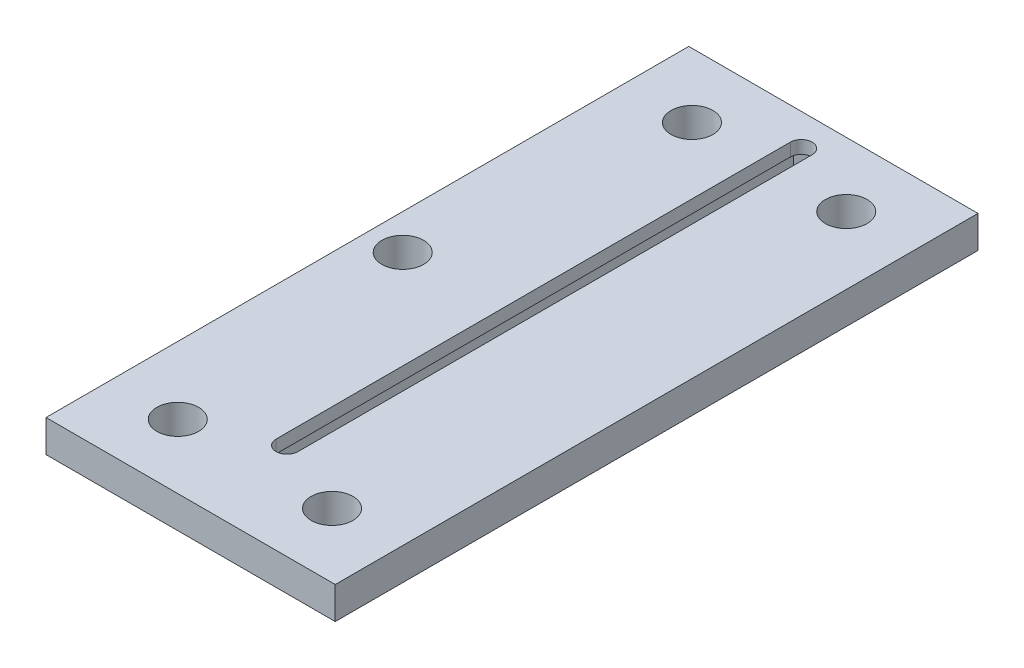
ISO-10303-21;
HEADER;
FILE_DESCRIPTION(('STEP AP214'),'2;1');
FILE_NAME('part.step','',(''),(''),'','','');
FILE_SCHEMA(('AUTOMOTIVE_DESIGN { 1 0 10303 214 1 1 1 1 }'));
ENDSEC;
DATA;
#1=APPLICATION_CONTEXT('core data for automotive mechanical design processes');
#2=APPLICATION_PROTOCOL_DEFINITION('international standard','automotive_design',2000,#1);
#3=PRODUCT_CONTEXT('',#1,'mechanical');
#4=PRODUCT('Part','Part','',(#3));
#5=PRODUCT_RELATED_PRODUCT_CATEGORY('part','',(#4));
#6=PRODUCT_DEFINITION_FORMATION('','',#4);
#7=PRODUCT_DEFINITION_CONTEXT('part definition',#1,'design');
#8=PRODUCT_DEFINITION('design','',#6,#7);
#9=PRODUCT_DEFINITION_SHAPE('','',#8);
#10=(LENGTH_UNIT() NAMED_UNIT(*) SI_UNIT(.MILLI.,.METRE.));
#11=(NAMED_UNIT(*) PLANE_ANGLE_UNIT() SI_UNIT($,.RADIAN.));
#12=(NAMED_UNIT(*) SI_UNIT($,.STERADIAN.) SOLID_ANGLE_UNIT());
#13=UNCERTAINTY_MEASURE_WITH_UNIT(LENGTH_MEASURE(1.E-05),#10,'distance_accuracy_value','');
#14=(GEOMETRIC_REPRESENTATION_CONTEXT(3) GLOBAL_UNCERTAINTY_ASSIGNED_CONTEXT((#13)) GLOBAL_UNIT_ASSIGNED_CONTEXT((#10,
#11,#12)) REPRESENTATION_CONTEXT('',''));
#15=CARTESIAN_POINT('',(0.,0.,0.));
#16=DIRECTION('',(0.,0.,1.));
#17=DIRECTION('',(1.,0.,0.));
#18=AXIS2_PLACEMENT_3D('',#15,#16,#17);
#19=CARTESIAN_POINT('',(0.,5.,0.));
#20=DIRECTION('',(0.,-1.,0.));
#21=DIRECTION('',(0.,0.,-1.));
#22=AXIS2_PLACEMENT_3D('',#19,#20,#21);
#23=PLANE('',#22);
#24=DIRECTION('',(0.,0.,1.));
#25=VECTOR('',#24,1.);
#26=CARTESIAN_POINT('',(-1.7,5.,-45.));
#27=LINE('',#26,#25);
#28=CARTESIAN_POINT('',(-1.7,5.,-45.));
#29=VERTEX_POINT('',#28);
#30=CARTESIAN_POINT('',(-1.69999999999999,5.,35.));
#31=VERTEX_POINT('',#30);
#32=EDGE_CURVE('E201',#29,#31,#27,.T.);
#33=ORIENTED_EDGE('',*,*,#32,.F.);
#34=CARTESIAN_POINT('',(0.,5.,-45.));
#35=DIRECTION('',(0.,1.,0.));
#36=DIRECTION('',(0.,0.,1.));
#37=AXIS2_PLACEMENT_3D('',#34,#35,#36);
#38=CIRCLE('',#37,1.7);
#39=CARTESIAN_POINT('',(1.7,5.,-45.));
#40=VERTEX_POINT('',#39);
#41=EDGE_CURVE('E62',#40,#29,#38,.T.);
#42=ORIENTED_EDGE('',*,*,#41,.F.);
#43=DIRECTION('',(0.,0.,-1.));
#44=VECTOR('',#43,1.);
#45=CARTESIAN_POINT('',(1.7,5.,-45.));
#46=LINE('',#45,#44);
#47=CARTESIAN_POINT('',(1.70000000000001,5.,35.));
#48=VERTEX_POINT('',#47);
#49=EDGE_CURVE('E193',#48,#40,#46,.T.);
#50=ORIENTED_EDGE('',*,*,#49,.F.);
#51=CARTESIAN_POINT('',(0.,5.,35.));
#52=DIRECTION('',(0.,1.,0.));
#53=DIRECTION('',(0.,0.,1.));
#54=AXIS2_PLACEMENT_3D('',#51,#52,#53);
#55=CIRCLE('',#54,1.7);
#56=EDGE_CURVE('E204',#31,#48,#55,.T.);
#57=ORIENTED_EDGE('',*,*,#56,.F.);
#58=EDGE_LOOP('',(#33,#42,#50,#57));
#59=FACE_BOUND('',#58,.T.);
#60=DIRECTION('',(0.,0.,-1.));
#61=VECTOR('',#60,1.);
#62=CARTESIAN_POINT('',(22.5,5.,50.));
#63=LINE('',#62,#61);
#64=CARTESIAN_POINT('',(22.5,5.,50.));
#65=VERTEX_POINT('',#64);
#66=CARTESIAN_POINT('',(22.5,5.,-50.));
#67=VERTEX_POINT('',#66);
#68=EDGE_CURVE('E247',#65,#67,#63,.T.);
#69=ORIENTED_EDGE('',*,*,#68,.T.);
#70=DIRECTION('',(-1.,0.,0.));
#71=VECTOR('',#70,1.);
#72=CARTESIAN_POINT('',(-22.5,5.,-50.));
#73=LINE('',#72,#71);
#74=CARTESIAN_POINT('',(-22.5,5.,-50.));
#75=VERTEX_POINT('',#74);
#76=EDGE_CURVE('E250',#67,#75,#73,.T.);
#77=ORIENTED_EDGE('',*,*,#76,.T.);
#78=DIRECTION('',(0.,0.,1.));
#79=VECTOR('',#78,1.);
#80=CARTESIAN_POINT('',(-22.5,5.,50.));
#81=LINE('',#80,#79);
#82=CARTESIAN_POINT('',(-22.5,5.,50.));
#83=VERTEX_POINT('',#82);
#84=EDGE_CURVE('E253',#75,#83,#81,.T.);
#85=ORIENTED_EDGE('',*,*,#84,.T.);
#86=DIRECTION('',(1.,0.,0.));
#87=VECTOR('',#86,1.);
#88=CARTESIAN_POINT('',(-22.5,5.,50.));
#89=LINE('',#88,#87);
#90=EDGE_CURVE('E255',#83,#65,#89,.T.);
#91=ORIENTED_EDGE('',*,*,#90,.T.);
#92=EDGE_LOOP('',(#69,#77,#85,#91));
#93=FACE_BOUND('',#92,.T.);
#94=CARTESIAN_POINT('',(-12.,5.,-40.));
#95=DIRECTION('',(0.,1.,0.));
#96=DIRECTION('',(0.,0.,1.));
#97=AXIS2_PLACEMENT_3D('',#94,#95,#96);
#98=CIRCLE('',#97,3.25);
#99=CARTESIAN_POINT('',(-12.,5.,-36.75));
#100=VERTEX_POINT('',#99);
#101=EDGE_CURVE('E241',#100,#100,#98,.T.);
#102=ORIENTED_EDGE('',*,*,#101,.F.);
#103=EDGE_LOOP('',(#102));
#104=FACE_BOUND('',#103,.T.);
#105=CARTESIAN_POINT('',(12.,5.,-40.));
#106=DIRECTION('',(0.,1.,0.));
#107=DIRECTION('',(0.,0.,1.));
#108=AXIS2_PLACEMENT_3D('',#105,#106,#107);
#109=CIRCLE('',#108,3.25);
#110=CARTESIAN_POINT('',(12.,5.,-36.75));
#111=VERTEX_POINT('',#110);
#112=EDGE_CURVE('E235',#111,#111,#109,.T.);
#113=ORIENTED_EDGE('',*,*,#112,.F.);
#114=EDGE_LOOP('',(#113));
#115=FACE_BOUND('',#114,.T.);
#116=CARTESIAN_POINT('',(12.,5.,40.));
#117=DIRECTION('',(0.,1.,0.));
#118=DIRECTION('',(0.,0.,1.));
#119=AXIS2_PLACEMENT_3D('',#116,#117,#118);
#120=CIRCLE('',#119,3.25);
#121=CARTESIAN_POINT('',(12.,5.,43.25));
#122=VERTEX_POINT('',#121);
#123=EDGE_CURVE('E229',#122,#122,#120,.T.);
#124=ORIENTED_EDGE('',*,*,#123,.F.);
#125=EDGE_LOOP('',(#124));
#126=FACE_BOUND('',#125,.T.);
#127=CARTESIAN_POINT('',(-12.,5.,40.));
#128=DIRECTION('',(0.,1.,0.));
#129=DIRECTION('',(0.,0.,1.));
#130=AXIS2_PLACEMENT_3D('',#127,#128,#129);
#131=CIRCLE('',#130,3.25);
#132=CARTESIAN_POINT('',(-12.,5.,43.25));
#133=VERTEX_POINT('',#132);
#134=EDGE_CURVE('E223',#133,#133,#131,.T.);
#135=ORIENTED_EDGE('',*,*,#134,.F.);
#136=EDGE_LOOP('',(#135));
#137=FACE_BOUND('',#136,.T.);
#138=CARTESIAN_POINT('',(-17.,5.,0.));
#139=DIRECTION('',(0.,1.,0.));
#140=DIRECTION('',(0.,0.,1.));
#141=AXIS2_PLACEMENT_3D('',#138,#139,#140);
#142=CIRCLE('',#141,3.25);
#143=CARTESIAN_POINT('',(-17.,5.,3.25));
#144=VERTEX_POINT('',#143);
#145=EDGE_CURVE('E217',#144,#144,#142,.T.);
#146=ORIENTED_EDGE('',*,*,#145,.F.);
#147=EDGE_LOOP('',(#146));
#148=FACE_BOUND('',#147,.T.);
#149=ADVANCED_FACE('F39',(#59,#93,#104,#115,#126,#137,#148),#23,.F.);
#150=CARTESIAN_POINT('',(0.,0.,0.));
#151=DIRECTION('',(0.,-1.,0.));
#152=DIRECTION('',(0.,0.,-1.));
#153=AXIS2_PLACEMENT_3D('',#150,#151,#152);
#154=PLANE('',#153);
#155=DIRECTION('',(0.,0.,1.));
#156=VECTOR('',#155,1.);
#157=CARTESIAN_POINT('',(-2.9,0.,0.));
#158=LINE('',#157,#156);
#159=CARTESIAN_POINT('',(-2.9,0.,-46.6743157806499));
#160=VERTEX_POINT('',#159);
#161=CARTESIAN_POINT('',(-2.9,0.,36.6743157806499));
#162=VERTEX_POINT('',#161);
#163=EDGE_CURVE('E152',#160,#162,#158,.T.);
#164=ORIENTED_EDGE('',*,*,#163,.T.);
#165=DIRECTION('',(0.866025403784438,0.,0.500000000000001));
#166=VECTOR('',#165,1.);
#167=CARTESIAN_POINT('',(-16.6054445662277,0.,28.7614736709748));
#168=LINE('',#167,#166);
#169=CARTESIAN_POINT('',(0.,0.,38.3486315612998));
#170=VERTEX_POINT('',#169);
#171=EDGE_CURVE('E139',#162,#170,#168,.T.);
#172=ORIENTED_EDGE('',*,*,#171,.T.);
#173=DIRECTION('',(0.866025403784439,0.,-0.5));
#174=VECTOR('',#173,1.);
#175=CARTESIAN_POINT('',(16.6054445662277,0.,28.7614736709748));
#176=LINE('',#175,#174);
#177=CARTESIAN_POINT('',(2.9,0.,36.6743157806499));
#178=VERTEX_POINT('',#177);
#179=EDGE_CURVE('E507',#170,#178,#176,.T.);
#180=ORIENTED_EDGE('',*,*,#179,.T.);
#181=DIRECTION('',(0.,0.,-1.));
#182=VECTOR('',#181,1.);
#183=CARTESIAN_POINT('',(2.90000000000001,0.,0.));
#184=LINE('',#183,#182);
#185=CARTESIAN_POINT('',(2.9,0.,-46.6743157806499));
#186=VERTEX_POINT('',#185);
#187=EDGE_CURVE('E506',#178,#186,#184,.T.);
#188=ORIENTED_EDGE('',*,*,#187,.T.);
#189=DIRECTION('',(-0.866025403784437,0.,-0.500000000000002));
#190=VECTOR('',#189,1.);
#191=CARTESIAN_POINT('',(20.9355715851499,0.,-36.2614736709748));
#192=LINE('',#191,#190);
#193=CARTESIAN_POINT('',(0.,0.,-48.3486315612998));
#194=VERTEX_POINT('',#193);
#195=EDGE_CURVE('E166',#186,#194,#192,.T.);
#196=ORIENTED_EDGE('',*,*,#195,.T.);
#197=DIRECTION('',(-0.866025403784438,0.,0.500000000000001));
#198=VECTOR('',#197,1.);
#199=CARTESIAN_POINT('',(-20.9355715851499,0.,-36.2614736709748));
#200=LINE('',#199,#198);
#201=EDGE_CURVE('E162',#194,#160,#200,.T.);
#202=ORIENTED_EDGE('',*,*,#201,.T.);
#203=EDGE_LOOP('',(#164,#172,#180,#188,#196,#202));
#204=FACE_BOUND('',#203,.T.);
#205=CARTESIAN_POINT('',(-12.,0.,40.));
#206=DIRECTION('',(0.,1.,0.));
#207=DIRECTION('',(0.,0.,1.));
#208=AXIS2_PLACEMENT_3D('',#205,#206,#207);
#209=CIRCLE('',#208,3.25);
#210=CARTESIAN_POINT('',(-12.,0.,43.25));
#211=VERTEX_POINT('',#210);
#212=EDGE_CURVE('E220',#211,#211,#209,.T.);
#213=ORIENTED_EDGE('',*,*,#212,.T.);
#214=EDGE_LOOP('',(#213));
#215=FACE_BOUND('',#214,.T.);
#216=CARTESIAN_POINT('',(12.,0.,-40.));
#217=DIRECTION('',(0.,1.,0.));
#218=DIRECTION('',(0.,0.,1.));
#219=AXIS2_PLACEMENT_3D('',#216,#217,#218);
#220=CIRCLE('',#219,3.25);
#221=CARTESIAN_POINT('',(12.,0.,-36.75));
#222=VERTEX_POINT('',#221);
#223=EDGE_CURVE('E232',#222,#222,#220,.T.);
#224=ORIENTED_EDGE('',*,*,#223,.T.);
#225=EDGE_LOOP('',(#224));
#226=FACE_BOUND('',#225,.T.);
#227=DIRECTION('',(0.,0.,-1.));
#228=VECTOR('',#227,1.);
#229=CARTESIAN_POINT('',(22.5,0.,50.));
#230=LINE('',#229,#228);
#231=CARTESIAN_POINT('',(22.5,0.,50.));
#232=VERTEX_POINT('',#231);
#233=CARTESIAN_POINT('',(22.5,0.,-50.));
#234=VERTEX_POINT('',#233);
#235=EDGE_CURVE('E244',#232,#234,#230,.T.);
#236=ORIENTED_EDGE('',*,*,#235,.F.);
#237=DIRECTION('',(1.,0.,0.));
#238=VECTOR('',#237,1.);
#239=CARTESIAN_POINT('',(-22.5,0.,50.));
#240=LINE('',#239,#238);
#241=CARTESIAN_POINT('',(-22.5,0.,50.));
#242=VERTEX_POINT('',#241);
#243=EDGE_CURVE('E251',#242,#232,#240,.T.);
#244=ORIENTED_EDGE('',*,*,#243,.F.);
#245=DIRECTION('',(0.,0.,1.));
#246=VECTOR('',#245,1.);
#247=CARTESIAN_POINT('',(-22.5,0.,50.));
#248=LINE('',#247,#246);
#249=CARTESIAN_POINT('',(-22.5,0.,-50.));
#250=VERTEX_POINT('',#249);
#251=EDGE_CURVE('E262',#250,#242,#248,.T.);
#252=ORIENTED_EDGE('',*,*,#251,.F.);
#253=DIRECTION('',(-1.,0.,0.));
#254=VECTOR('',#253,1.);
#255=CARTESIAN_POINT('',(-22.5,0.,-50.));
#256=LINE('',#255,#254);
#257=EDGE_CURVE('E260',#234,#250,#256,.T.);
#258=ORIENTED_EDGE('',*,*,#257,.F.);
#259=EDGE_LOOP('',(#236,#244,#252,#258));
#260=FACE_BOUND('',#259,.T.);
#261=CARTESIAN_POINT('',(-12.,0.,-40.));
#262=DIRECTION('',(0.,1.,0.));
#263=DIRECTION('',(0.,0.,1.));
#264=AXIS2_PLACEMENT_3D('',#261,#262,#263);
#265=CIRCLE('',#264,3.25);
#266=CARTESIAN_POINT('',(-12.,0.,-36.75));
#267=VERTEX_POINT('',#266);
#268=EDGE_CURVE('E238',#267,#267,#265,.T.);
#269=ORIENTED_EDGE('',*,*,#268,.T.);
#270=EDGE_LOOP('',(#269));
#271=FACE_BOUND('',#270,.T.);
#272=CARTESIAN_POINT('',(12.,0.,40.));
#273=DIRECTION('',(0.,1.,0.));
#274=DIRECTION('',(0.,0.,1.));
#275=AXIS2_PLACEMENT_3D('',#272,#273,#274);
#276=CIRCLE('',#275,3.25);
#277=CARTESIAN_POINT('',(12.,0.,43.25));
#278=VERTEX_POINT('',#277);
#279=EDGE_CURVE('E226',#278,#278,#276,.T.);
#280=ORIENTED_EDGE('',*,*,#279,.T.);
#281=EDGE_LOOP('',(#280));
#282=FACE_BOUND('',#281,.T.);
#283=CARTESIAN_POINT('',(-17.,0.,0.));
#284=DIRECTION('',(0.,1.,0.));
#285=DIRECTION('',(0.,0.,1.));
#286=AXIS2_PLACEMENT_3D('',#283,#284,#285);
#287=CIRCLE('',#286,3.25);
#288=CARTESIAN_POINT('',(-17.,0.,3.25));
#289=VERTEX_POINT('',#288);
#290=EDGE_CURVE('E211',#289,#289,#287,.T.);
#291=ORIENTED_EDGE('',*,*,#290,.T.);
#292=EDGE_LOOP('',(#291));
#293=FACE_BOUND('',#292,.T.);
#294=ADVANCED_FACE('F159',(#204,#215,#226,#260,#271,#282,#293),#154,.T.);
#295=CARTESIAN_POINT('',(22.5,5.,50.));
#296=DIRECTION('',(-1.,0.,0.));
#297=DIRECTION('',(0.,0.,1.));
#298=AXIS2_PLACEMENT_3D('',#295,#296,#297);
#299=PLANE('',#298);
#300=ORIENTED_EDGE('',*,*,#235,.T.);
#301=DIRECTION('',(0.,-1.,0.));
#302=VECTOR('',#301,1.);
#303=CARTESIAN_POINT('',(22.5,5.,-50.));
#304=LINE('',#303,#302);
#305=EDGE_CURVE('E11',#67,#234,#304,.T.);
#306=ORIENTED_EDGE('',*,*,#305,.F.);
#307=ORIENTED_EDGE('',*,*,#68,.F.);
#308=DIRECTION('',(0.,-1.,0.));
#309=VECTOR('',#308,1.);
#310=CARTESIAN_POINT('',(22.5,5.,50.));
#311=LINE('',#310,#309);
#312=EDGE_CURVE('E257',#65,#232,#311,.T.);
#313=ORIENTED_EDGE('',*,*,#312,.T.);
#314=EDGE_LOOP('',(#300,#306,#307,#313));
#315=FACE_BOUND('',#314,.T.);
#316=ADVANCED_FACE('F41',(#315),#299,.F.);
#317=CARTESIAN_POINT('',(-22.5,5.,-50.));
#318=DIRECTION('',(0.,0.,1.));
#319=DIRECTION('',(1.,0.,0.));
#320=AXIS2_PLACEMENT_3D('',#317,#318,#319);
#321=PLANE('',#320);
#322=ORIENTED_EDGE('',*,*,#257,.T.);
#323=DIRECTION('',(0.,-1.,0.));
#324=VECTOR('',#323,1.);
#325=CARTESIAN_POINT('',(-22.5,5.,-50.));
#326=LINE('',#325,#324);
#327=EDGE_CURVE('E47',#75,#250,#326,.T.);
#328=ORIENTED_EDGE('',*,*,#327,.F.);
#329=ORIENTED_EDGE('',*,*,#76,.F.);
#330=ORIENTED_EDGE('',*,*,#305,.T.);
#331=EDGE_LOOP('',(#322,#328,#329,#330));
#332=FACE_BOUND('',#331,.T.);
#333=ADVANCED_FACE('F290',(#332),#321,.F.);
#334=CARTESIAN_POINT('',(-22.5,5.,50.));
#335=DIRECTION('',(1.,0.,0.));
#336=DIRECTION('',(0.,0.,-1.));
#337=AXIS2_PLACEMENT_3D('',#334,#335,#336);
#338=PLANE('',#337);
#339=ORIENTED_EDGE('',*,*,#251,.T.);
#340=DIRECTION('',(0.,-1.,0.));
#341=VECTOR('',#340,1.);
#342=CARTESIAN_POINT('',(-22.5,5.,50.));
#343=LINE('',#342,#341);
#344=EDGE_CURVE('E267',#83,#242,#343,.T.);
#345=ORIENTED_EDGE('',*,*,#344,.F.);
#346=ORIENTED_EDGE('',*,*,#84,.F.);
#347=ORIENTED_EDGE('',*,*,#327,.T.);
#348=EDGE_LOOP('',(#339,#345,#346,#347));
#349=FACE_BOUND('',#348,.T.);
#350=ADVANCED_FACE('F274',(#349),#338,.F.);
#351=CARTESIAN_POINT('',(-22.5,5.,50.));
#352=DIRECTION('',(0.,0.,-1.));
#353=DIRECTION('',(-1.,0.,0.));
#354=AXIS2_PLACEMENT_3D('',#351,#352,#353);
#355=PLANE('',#354);
#356=ORIENTED_EDGE('',*,*,#243,.T.);
#357=ORIENTED_EDGE('',*,*,#312,.F.);
#358=ORIENTED_EDGE('',*,*,#90,.F.);
#359=ORIENTED_EDGE('',*,*,#344,.T.);
#360=EDGE_LOOP('',(#356,#357,#358,#359));
#361=FACE_BOUND('',#360,.T.);
#362=ADVANCED_FACE('F283',(#361),#355,.F.);
#363=CARTESIAN_POINT('',(-12.,5.,-40.));
#364=DIRECTION('',(0.,-1.,0.));
#365=DIRECTION('',(0.,0.,-1.));
#366=AXIS2_PLACEMENT_3D('',#363,#364,#365);
#367=CYLINDRICAL_SURFACE('',#366,3.25);
#368=ORIENTED_EDGE('',*,*,#101,.T.);
#369=EDGE_LOOP('',(#368));
#370=FACE_BOUND('',#369,.T.);
#371=ORIENTED_EDGE('',*,*,#268,.F.);
#372=EDGE_LOOP('',(#371));
#373=FACE_BOUND('',#372,.T.);
#374=ADVANCED_FACE('F307',(#370,#373),#367,.F.);
#375=CARTESIAN_POINT('',(12.,5.,-40.));
#376=DIRECTION('',(0.,-1.,0.));
#377=DIRECTION('',(0.,0.,-1.));
#378=AXIS2_PLACEMENT_3D('',#375,#376,#377);
#379=CYLINDRICAL_SURFACE('',#378,3.25);
#380=ORIENTED_EDGE('',*,*,#112,.T.);
#381=EDGE_LOOP('',(#380));
#382=FACE_BOUND('',#381,.T.);
#383=ORIENTED_EDGE('',*,*,#223,.F.);
#384=EDGE_LOOP('',(#383));
#385=FACE_BOUND('',#384,.T.);
#386=ADVANCED_FACE('F314',(#382,#385),#379,.F.);
#387=CARTESIAN_POINT('',(12.,5.,40.));
#388=DIRECTION('',(0.,-1.,0.));
#389=DIRECTION('',(0.,0.,-1.));
#390=AXIS2_PLACEMENT_3D('',#387,#388,#389);
#391=CYLINDRICAL_SURFACE('',#390,3.25);
#392=ORIENTED_EDGE('',*,*,#123,.T.);
#393=EDGE_LOOP('',(#392));
#394=FACE_BOUND('',#393,.T.);
#395=ORIENTED_EDGE('',*,*,#279,.F.);
#396=EDGE_LOOP('',(#395));
#397=FACE_BOUND('',#396,.T.);
#398=ADVANCED_FACE('F319',(#394,#397),#391,.F.);
#399=CARTESIAN_POINT('',(-12.,5.,40.));
#400=DIRECTION('',(0.,-1.,0.));
#401=DIRECTION('',(0.,0.,-1.));
#402=AXIS2_PLACEMENT_3D('',#399,#400,#401);
#403=CYLINDRICAL_SURFACE('',#402,3.25);
#404=ORIENTED_EDGE('',*,*,#134,.T.);
#405=EDGE_LOOP('',(#404));
#406=FACE_BOUND('',#405,.T.);
#407=ORIENTED_EDGE('',*,*,#212,.F.);
#408=EDGE_LOOP('',(#407));
#409=FACE_BOUND('',#408,.T.);
#410=ADVANCED_FACE('F331',(#406,#409),#403,.F.);
#411=CARTESIAN_POINT('',(-17.,5.,0.));
#412=DIRECTION('',(0.,-1.,0.));
#413=DIRECTION('',(0.,0.,-1.));
#414=AXIS2_PLACEMENT_3D('',#411,#412,#413);
#415=CYLINDRICAL_SURFACE('',#414,3.25);
#416=ORIENTED_EDGE('',*,*,#145,.T.);
#417=EDGE_LOOP('',(#416));
#418=FACE_BOUND('',#417,.T.);
#419=ORIENTED_EDGE('',*,*,#290,.F.);
#420=EDGE_LOOP('',(#419));
#421=FACE_BOUND('',#420,.T.);
#422=ADVANCED_FACE('F329',(#418,#421),#415,.F.);
#423=CARTESIAN_POINT('',(0.,3.,-45.));
#424=DIRECTION('',(0.,1.,0.));
#425=DIRECTION('',(0.,0.,1.));
#426=AXIS2_PLACEMENT_3D('',#423,#424,#425);
#427=CYLINDRICAL_SURFACE('',#426,1.7);
#428=ORIENTED_EDGE('',*,*,#41,.T.);
#429=DIRECTION('',(0.,1.,0.));
#430=VECTOR('',#429,1.);
#431=CARTESIAN_POINT('',(-1.7,3.,-45.));
#432=LINE('',#431,#430);
#433=CARTESIAN_POINT('',(-1.7,3.,-45.));
#434=VERTEX_POINT('',#433);
#435=EDGE_CURVE('E199',#434,#29,#432,.T.);
#436=ORIENTED_EDGE('',*,*,#435,.F.);
#437=CARTESIAN_POINT('',(0.,3.,-45.));
#438=DIRECTION('',(0.,1.,0.));
#439=DIRECTION('',(0.,0.,1.));
#440=AXIS2_PLACEMENT_3D('',#437,#438,#439);
#441=CIRCLE('',#440,1.7);
#442=CARTESIAN_POINT('',(1.7,3.,-45.));
#443=VERTEX_POINT('',#442);
#444=EDGE_CURVE('E190',#443,#434,#441,.T.);
#445=ORIENTED_EDGE('',*,*,#444,.F.);
#446=DIRECTION('',(0.,1.,0.));
#447=VECTOR('',#446,1.);
#448=CARTESIAN_POINT('',(1.7,3.,-45.));
#449=LINE('',#448,#447);
#450=EDGE_CURVE('E209',#443,#40,#449,.T.);
#451=ORIENTED_EDGE('',*,*,#450,.T.);
#452=EDGE_LOOP('',(#428,#436,#445,#451));
#453=FACE_BOUND('',#452,.T.);
#454=ADVANCED_FACE('F330',(#453),#427,.F.);
#455=CARTESIAN_POINT('',(1.7,3.,-45.));
#456=DIRECTION('',(1.,0.,0.));
#457=DIRECTION('',(0.,0.,-1.));
#458=AXIS2_PLACEMENT_3D('',#455,#456,#457);
#459=PLANE('',#458);
#460=ORIENTED_EDGE('',*,*,#49,.T.);
#461=ORIENTED_EDGE('',*,*,#450,.F.);
#462=DIRECTION('',(0.,0.,-1.));
#463=VECTOR('',#462,1.);
#464=CARTESIAN_POINT('',(1.7,3.,-45.));
#465=LINE('',#464,#463);
#466=CARTESIAN_POINT('',(1.70000000000001,3.,35.));
#467=VERTEX_POINT('',#466);
#468=EDGE_CURVE('E197',#467,#443,#465,.T.);
#469=ORIENTED_EDGE('',*,*,#468,.F.);
#470=DIRECTION('',(0.,1.,0.));
#471=VECTOR('',#470,1.);
#472=CARTESIAN_POINT('',(1.70000000000001,3.,35.));
#473=LINE('',#472,#471);
#474=EDGE_CURVE('E212',#467,#48,#473,.T.);
#475=ORIENTED_EDGE('',*,*,#474,.T.);
#476=EDGE_LOOP('',(#460,#461,#469,#475));
#477=FACE_BOUND('',#476,.T.);
#478=ADVANCED_FACE('F338',(#477),#459,.F.);
#479=CARTESIAN_POINT('',(0.,3.,35.));
#480=DIRECTION('',(0.,1.,0.));
#481=DIRECTION('',(0.,0.,1.));
#482=AXIS2_PLACEMENT_3D('',#479,#480,#481);
#483=CYLINDRICAL_SURFACE('',#482,1.7);
#484=ORIENTED_EDGE('',*,*,#56,.T.);
#485=ORIENTED_EDGE('',*,*,#474,.F.);
#486=CARTESIAN_POINT('',(0.,3.,35.));
#487=DIRECTION('',(0.,1.,0.));
#488=DIRECTION('',(0.,0.,1.));
#489=AXIS2_PLACEMENT_3D('',#486,#487,#488);
#490=CIRCLE('',#489,1.7);
#491=CARTESIAN_POINT('',(-1.69999999999999,3.,35.));
#492=VERTEX_POINT('',#491);
#493=EDGE_CURVE('E195',#492,#467,#490,.T.);
#494=ORIENTED_EDGE('',*,*,#493,.F.);
#495=DIRECTION('',(0.,1.,0.));
#496=VECTOR('',#495,1.);
#497=CARTESIAN_POINT('',(-1.69999999999999,3.,35.));
#498=LINE('',#497,#496);
#499=EDGE_CURVE('E214',#492,#31,#498,.T.);
#500=ORIENTED_EDGE('',*,*,#499,.T.);
#501=EDGE_LOOP('',(#484,#485,#494,#500));
#502=FACE_BOUND('',#501,.T.);
#503=ADVANCED_FACE('F387',(#502),#483,.F.);
#504=CARTESIAN_POINT('',(-1.7,3.,-45.));
#505=DIRECTION('',(-1.,0.,0.));
#506=DIRECTION('',(0.,0.,1.));
#507=AXIS2_PLACEMENT_3D('',#504,#505,#506);
#508=PLANE('',#507);
#509=ORIENTED_EDGE('',*,*,#32,.T.);
#510=ORIENTED_EDGE('',*,*,#499,.F.);
#511=DIRECTION('',(0.,0.,1.));
#512=VECTOR('',#511,1.);
#513=CARTESIAN_POINT('',(-1.7,3.,-45.));
#514=LINE('',#513,#512);
#515=EDGE_CURVE('E192',#434,#492,#514,.T.);
#516=ORIENTED_EDGE('',*,*,#515,.F.);
#517=ORIENTED_EDGE('',*,*,#435,.T.);
#518=EDGE_LOOP('',(#509,#510,#516,#517));
#519=FACE_BOUND('',#518,.T.);
#520=ADVANCED_FACE('F397',(#519),#508,.F.);
#521=CARTESIAN_POINT('',(-2.9,-0.00100000000000013,0.));
#522=DIRECTION('',(-1.,0.,0.));
#523=DIRECTION('',(0.,0.,1.));
#524=AXIS2_PLACEMENT_3D('',#521,#522,#523);
#525=PLANE('',#524);
#526=DIRECTION('',(0.,1.,0.));
#527=VECTOR('',#526,1.);
#528=CARTESIAN_POINT('',(-2.9,-0.00100000000000013,-46.6743157806499));
#529=LINE('',#528,#527);
#530=CARTESIAN_POINT('',(-2.9,3.,-46.6743157806499));
#531=VERTEX_POINT('',#530);
#532=EDGE_CURVE('E147',#160,#531,#529,.T.);
#533=ORIENTED_EDGE('',*,*,#532,.T.);
#534=DIRECTION('',(0.,0.,1.));
#535=VECTOR('',#534,1.);
#536=CARTESIAN_POINT('',(-2.9,3.,0.));
#537=LINE('',#536,#535);
#538=CARTESIAN_POINT('',(-2.9,3.,36.6743157806499));
#539=VERTEX_POINT('',#538);
#540=EDGE_CURVE('E155',#531,#539,#537,.T.);
#541=ORIENTED_EDGE('',*,*,#540,.T.);
#542=DIRECTION('',(0.,1.,0.));
#543=VECTOR('',#542,1.);
#544=CARTESIAN_POINT('',(-2.9,-0.00100000000000013,36.6743157806499));
#545=LINE('',#544,#543);
#546=EDGE_CURVE('E142',#162,#539,#545,.T.);
#547=ORIENTED_EDGE('',*,*,#546,.F.);
#548=ORIENTED_EDGE('',*,*,#163,.F.);
#549=EDGE_LOOP('',(#533,#541,#547,#548));
#550=FACE_BOUND('',#549,.T.);
#551=ADVANCED_FACE('F151',(#550),#525,.F.);
#552=CARTESIAN_POINT('',(-20.9355715851499,-0.00100000000000013,-36.2614736709748));
#553=DIRECTION('',(-0.500000000000001,0.,-0.866025403784438));
#554=DIRECTION('',(-0.866025403784438,0.,0.500000000000001));
#555=AXIS2_PLACEMENT_3D('',#552,#553,#554);
#556=PLANE('',#555);
#557=DIRECTION('',(0.,1.,0.));
#558=VECTOR('',#557,1.);
#559=CARTESIAN_POINT('',(0.,-0.00100000000000013,-48.3486315612998));
#560=LINE('',#559,#558);
#561=CARTESIAN_POINT('',(0.,3.,-48.3486315612998));
#562=VERTEX_POINT('',#561);
#563=EDGE_CURVE('E183',#194,#562,#560,.T.);
#564=ORIENTED_EDGE('',*,*,#563,.T.);
#565=DIRECTION('',(-0.866025403784438,0.,0.500000000000001));
#566=VECTOR('',#565,1.);
#567=CARTESIAN_POINT('',(-20.9355715851499,3.,-36.2614736709748));
#568=LINE('',#567,#566);
#569=EDGE_CURVE('E156',#562,#531,#568,.T.);
#570=ORIENTED_EDGE('',*,*,#569,.T.);
#571=ORIENTED_EDGE('',*,*,#532,.F.);
#572=ORIENTED_EDGE('',*,*,#201,.F.);
#573=EDGE_LOOP('',(#564,#570,#571,#572));
#574=FACE_BOUND('',#573,.T.);
#575=ADVANCED_FACE('F415',(#574),#556,.F.);
#576=CARTESIAN_POINT('',(20.9355715851499,-0.00100000000000013,-36.2614736709748));
#577=DIRECTION('',(0.500000000000002,0.,-0.866025403784437));
#578=DIRECTION('',(-0.866025403784437,0.,-0.500000000000002));
#579=AXIS2_PLACEMENT_3D('',#576,#577,#578);
#580=PLANE('',#579);
#581=DIRECTION('',(0.,1.,0.));
#582=VECTOR('',#581,1.);
#583=CARTESIAN_POINT('',(2.9,-0.00100000000000013,-46.6743157806499));
#584=LINE('',#583,#582);
#585=CARTESIAN_POINT('',(2.9,3.,-46.6743157806499));
#586=VERTEX_POINT('',#585);
#587=EDGE_CURVE('E185',#186,#586,#584,.T.);
#588=ORIENTED_EDGE('',*,*,#587,.T.);
#589=DIRECTION('',(-0.866025403784437,0.,-0.500000000000002));
#590=VECTOR('',#589,1.);
#591=CARTESIAN_POINT('',(20.9355715851499,3.,-36.2614736709748));
#592=LINE('',#591,#590);
#593=EDGE_CURVE('E177',#586,#562,#592,.T.);
#594=ORIENTED_EDGE('',*,*,#593,.T.);
#595=ORIENTED_EDGE('',*,*,#563,.F.);
#596=ORIENTED_EDGE('',*,*,#195,.F.);
#597=EDGE_LOOP('',(#588,#594,#595,#596));
#598=FACE_BOUND('',#597,.T.);
#599=ADVANCED_FACE('F430',(#598),#580,.F.);
#600=CARTESIAN_POINT('',(2.90000000000001,-0.00100000000000013,0.));
#601=DIRECTION('',(1.,0.,0.));
#602=DIRECTION('',(0.,0.,-1.));
#603=AXIS2_PLACEMENT_3D('',#600,#601,#602);
#604=PLANE('',#603);
#605=DIRECTION('',(0.,1.,0.));
#606=VECTOR('',#605,1.);
#607=CARTESIAN_POINT('',(2.9,-0.00100000000000013,36.6743157806499));
#608=LINE('',#607,#606);
#609=CARTESIAN_POINT('',(2.9,3.,36.6743157806499));
#610=VERTEX_POINT('',#609);
#611=EDGE_CURVE('E187',#178,#610,#608,.T.);
#612=ORIENTED_EDGE('',*,*,#611,.T.);
#613=DIRECTION('',(0.,0.,-1.));
#614=VECTOR('',#613,1.);
#615=CARTESIAN_POINT('',(2.90000000000001,3.,0.));
#616=LINE('',#615,#614);
#617=EDGE_CURVE('E174',#610,#586,#616,.T.);
#618=ORIENTED_EDGE('',*,*,#617,.T.);
#619=ORIENTED_EDGE('',*,*,#587,.F.);
#620=ORIENTED_EDGE('',*,*,#187,.F.);
#621=EDGE_LOOP('',(#612,#618,#619,#620));
#622=FACE_BOUND('',#621,.T.);
#623=ADVANCED_FACE('F440',(#622),#604,.F.);
#624=CARTESIAN_POINT('',(16.6054445662277,-0.00100000000000013,28.7614736709748));
#625=DIRECTION('',(0.5,0.,0.866025403784438));
#626=DIRECTION('',(0.866025403784439,0.,-0.5));
#627=AXIS2_PLACEMENT_3D('',#624,#625,#626);
#628=PLANE('',#627);
#629=DIRECTION('',(0.,1.,0.));
#630=VECTOR('',#629,1.);
#631=CARTESIAN_POINT('',(0.,-0.00100000000000013,38.3486315612998));
#632=LINE('',#631,#630);
#633=CARTESIAN_POINT('',(0.,3.,38.3486315612998));
#634=VERTEX_POINT('',#633);
#635=EDGE_CURVE('E54',#170,#634,#632,.T.);
#636=ORIENTED_EDGE('',*,*,#635,.T.);
#637=DIRECTION('',(0.866025403784438,0.,-0.5));
#638=VECTOR('',#637,1.);
#639=CARTESIAN_POINT('',(16.6054445662277,3.,28.7614736709748));
#640=LINE('',#639,#638);
#641=EDGE_CURVE('E171',#634,#610,#640,.T.);
#642=ORIENTED_EDGE('',*,*,#641,.T.);
#643=ORIENTED_EDGE('',*,*,#611,.F.);
#644=ORIENTED_EDGE('',*,*,#179,.F.);
#645=EDGE_LOOP('',(#636,#642,#643,#644));
#646=FACE_BOUND('',#645,.T.);
#647=ADVANCED_FACE('F450',(#646),#628,.F.);
#648=CARTESIAN_POINT('',(-16.6054445662277,-0.00100000000000013,28.7614736709748));
#649=DIRECTION('',(-0.500000000000001,0.,0.866025403784438));
#650=DIRECTION('',(0.866025403784438,0.,0.500000000000001));
#651=AXIS2_PLACEMENT_3D('',#648,#649,#650);
#652=PLANE('',#651);
#653=ORIENTED_EDGE('',*,*,#546,.T.);
#654=DIRECTION('',(0.866025403784438,0.,0.500000000000001));
#655=VECTOR('',#654,1.);
#656=CARTESIAN_POINT('',(-16.6054445662277,3.,28.7614736709748));
#657=LINE('',#656,#655);
#658=EDGE_CURVE('E164',#539,#634,#657,.T.);
#659=ORIENTED_EDGE('',*,*,#658,.T.);
#660=ORIENTED_EDGE('',*,*,#635,.F.);
#661=ORIENTED_EDGE('',*,*,#171,.F.);
#662=EDGE_LOOP('',(#653,#659,#660,#661));
#663=FACE_BOUND('',#662,.T.);
#664=ADVANCED_FACE('F141',(#663),#652,.F.);
#665=CARTESIAN_POINT('',(0.,3.,0.));
#666=DIRECTION('',(0.,1.,0.));
#667=DIRECTION('',(0.,0.,1.));
#668=AXIS2_PLACEMENT_3D('',#665,#666,#667);
#669=PLANE('',#668);
#670=ORIENTED_EDGE('',*,*,#444,.T.);
#671=ORIENTED_EDGE('',*,*,#515,.T.);
#672=ORIENTED_EDGE('',*,*,#493,.T.);
#673=ORIENTED_EDGE('',*,*,#468,.T.);
#674=EDGE_LOOP('',(#670,#671,#672,#673));
#675=FACE_BOUND('',#674,.T.);
#676=ORIENTED_EDGE('',*,*,#540,.F.);
#677=ORIENTED_EDGE('',*,*,#569,.F.);
#678=ORIENTED_EDGE('',*,*,#593,.F.);
#679=ORIENTED_EDGE('',*,*,#617,.F.);
#680=ORIENTED_EDGE('',*,*,#641,.F.);
#681=ORIENTED_EDGE('',*,*,#658,.F.);
#682=EDGE_LOOP('',(#676,#677,#678,#679,#680,#681));
#683=FACE_BOUND('',#682,.T.);
#684=ADVANCED_FACE('F475',(#675,#683),#669,.F.);
#685=CLOSED_SHELL('',(#149,#294,#316,#333,#350,#362,#374,#386,#398,#410,#422,#454,#478,#503,
#520,#551,#575,#599,#623,#647,#664,#684));
#686=MANIFOLD_SOLID_BREP('B2',#685);
#687=ADVANCED_BREP_SHAPE_REPRESENTATION('',(#18,#686),#14);
#688=SHAPE_DEFINITION_REPRESENTATION(#9,#687);
ENDSEC;
END-ISO-10303-21;
